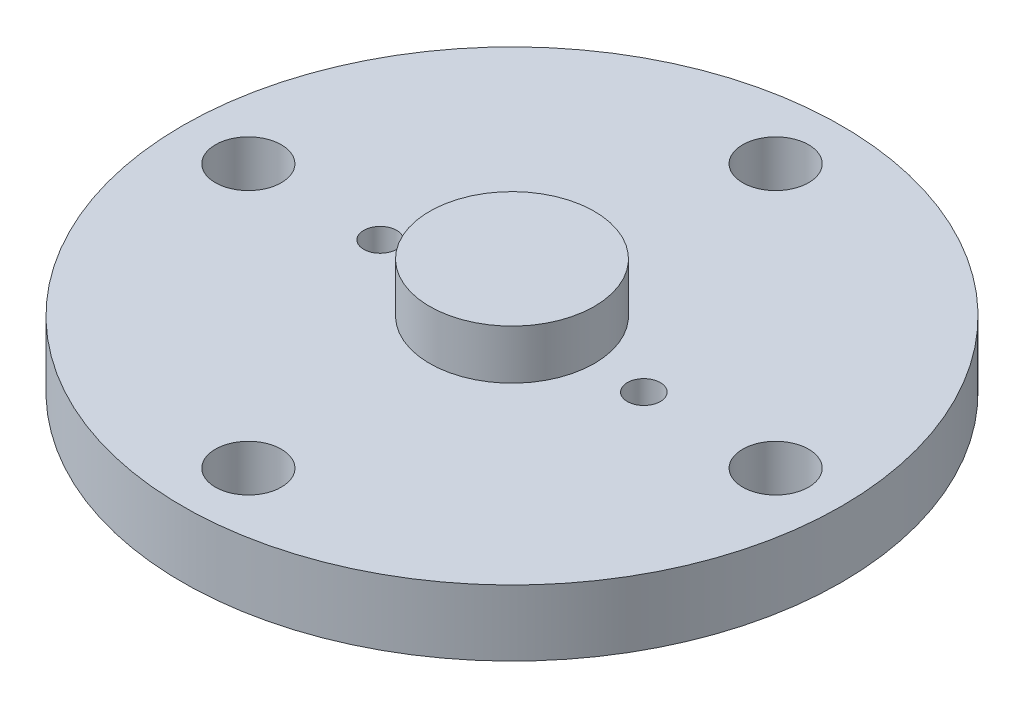
ISO-10303-21;
HEADER;
FILE_DESCRIPTION(('STEP AP214'),'2;1');
FILE_NAME('part.step','',(''),(''),'','','');
FILE_SCHEMA(('AUTOMOTIVE_DESIGN { 1 0 10303 214 1 1 1 1 }'));
ENDSEC;
DATA;
#1=APPLICATION_CONTEXT('core data for automotive mechanical design processes');
#2=APPLICATION_PROTOCOL_DEFINITION('international standard','automotive_design',2000,#1);
#3=PRODUCT_CONTEXT('',#1,'mechanical');
#4=PRODUCT('Part','Part','',(#3));
#5=PRODUCT_RELATED_PRODUCT_CATEGORY('part','',(#4));
#6=PRODUCT_DEFINITION_FORMATION('','',#4);
#7=PRODUCT_DEFINITION_CONTEXT('part definition',#1,'design');
#8=PRODUCT_DEFINITION('design','',#6,#7);
#9=PRODUCT_DEFINITION_SHAPE('','',#8);
#10=(LENGTH_UNIT() NAMED_UNIT(*) SI_UNIT(.MILLI.,.METRE.));
#11=(NAMED_UNIT(*) PLANE_ANGLE_UNIT() SI_UNIT($,.RADIAN.));
#12=(NAMED_UNIT(*) SI_UNIT($,.STERADIAN.) SOLID_ANGLE_UNIT());
#13=UNCERTAINTY_MEASURE_WITH_UNIT(LENGTH_MEASURE(1.E-05),#10,'distance_accuracy_value','');
#14=(GEOMETRIC_REPRESENTATION_CONTEXT(3) GLOBAL_UNCERTAINTY_ASSIGNED_CONTEXT((#13)) GLOBAL_UNIT_ASSIGNED_CONTEXT((#10,
#11,#12)) REPRESENTATION_CONTEXT('',''));
#15=CARTESIAN_POINT('',(0.,0.,0.));
#16=DIRECTION('',(0.,0.,1.));
#17=DIRECTION('',(1.,0.,0.));
#18=AXIS2_PLACEMENT_3D('',#15,#16,#17);
#19=CARTESIAN_POINT('',(0.,0.,0.));
#20=DIRECTION('',(0.,1.,0.));
#21=DIRECTION('',(-1.,0.,0.));
#22=AXIS2_PLACEMENT_3D('',#19,#20,#21);
#23=PLANE('',#22);
#24=CARTESIAN_POINT('',(0.,0.,8.));
#25=DIRECTION('',(0.,1.,0.));
#26=DIRECTION('',(1.,0.,0.));
#27=AXIS2_PLACEMENT_3D('',#24,#25,#26);
#28=CIRCLE('',#27,0.999999999999999);
#29=CARTESIAN_POINT('',(0.99999999999997,0.,8.));
#30=VERTEX_POINT('',#29);
#31=EDGE_CURVE('E77',#30,#30,#28,.T.);
#32=ORIENTED_EDGE('',*,*,#31,.T.);
#33=EDGE_LOOP('',(#32));
#34=FACE_BOUND('',#33,.T.);
#35=CARTESIAN_POINT('',(0.,0.,-8.));
#36=DIRECTION('',(0.,1.,0.));
#37=DIRECTION('',(-1.,0.,0.));
#38=AXIS2_PLACEMENT_3D('',#35,#36,#37);
#39=CIRCLE('',#38,0.999999999999999);
#40=CARTESIAN_POINT('',(-1.00000000000003,0.,-8.));
#41=VERTEX_POINT('',#40);
#42=EDGE_CURVE('E71',#41,#41,#39,.T.);
#43=ORIENTED_EDGE('',*,*,#42,.T.);
#44=EDGE_LOOP('',(#43));
#45=FACE_BOUND('',#44,.T.);
#46=CARTESIAN_POINT('',(8.,0.,0.));
#47=DIRECTION('',(0.,1.,0.));
#48=DIRECTION('',(1.,0.,0.));
#49=AXIS2_PLACEMENT_3D('',#46,#47,#48);
#50=CIRCLE('',#49,1.);
#51=CARTESIAN_POINT('',(9.,0.,0.));
#52=VERTEX_POINT('',#51);
#53=EDGE_CURVE('E65',#52,#52,#50,.T.);
#54=ORIENTED_EDGE('',*,*,#53,.T.);
#55=EDGE_LOOP('',(#54));
#56=FACE_BOUND('',#55,.T.);
#57=CARTESIAN_POINT('',(4.,0.,0.));
#58=DIRECTION('',(0.,1.,0.));
#59=DIRECTION('',(1.,0.,0.));
#60=AXIS2_PLACEMENT_3D('',#57,#58,#59);
#61=CIRCLE('',#60,0.500000000000001);
#62=CARTESIAN_POINT('',(4.5,0.,0.));
#63=VERTEX_POINT('',#62);
#64=EDGE_CURVE('E59',#63,#63,#61,.T.);
#65=ORIENTED_EDGE('',*,*,#64,.T.);
#66=EDGE_LOOP('',(#65));
#67=FACE_BOUND('',#66,.T.);
#68=CARTESIAN_POINT('',(-4.,0.,0.));
#69=DIRECTION('',(0.,1.,0.));
#70=DIRECTION('',(-1.,0.,0.));
#71=AXIS2_PLACEMENT_3D('',#68,#69,#70);
#72=CIRCLE('',#71,0.5);
#73=CARTESIAN_POINT('',(-4.5,0.,0.));
#74=VERTEX_POINT('',#73);
#75=EDGE_CURVE('E53',#74,#74,#72,.T.);
#76=ORIENTED_EDGE('',*,*,#75,.T.);
#77=EDGE_LOOP('',(#76));
#78=FACE_BOUND('',#77,.T.);
#79=CARTESIAN_POINT('',(-8.,0.,0.));
#80=DIRECTION('',(0.,1.,0.));
#81=DIRECTION('',(-1.,0.,0.));
#82=AXIS2_PLACEMENT_3D('',#79,#80,#81);
#83=CIRCLE('',#82,1.);
#84=CARTESIAN_POINT('',(-9.,0.,0.));
#85=VERTEX_POINT('',#84);
#86=EDGE_CURVE('E49',#85,#85,#83,.T.);
#87=ORIENTED_EDGE('',*,*,#86,.T.);
#88=EDGE_LOOP('',(#87));
#89=FACE_BOUND('',#88,.T.);
#90=CARTESIAN_POINT('',(0.,0.,0.));
#91=DIRECTION('',(0.,-1.,0.));
#92=DIRECTION('',(1.,0.,0.));
#93=AXIS2_PLACEMENT_3D('',#90,#91,#92);
#94=CIRCLE('',#93,10.);
#95=CARTESIAN_POINT('',(10.,0.,0.));
#96=VERTEX_POINT('',#95);
#97=EDGE_CURVE('E10',#96,#96,#94,.T.);
#98=ORIENTED_EDGE('',*,*,#97,.T.);
#99=EDGE_LOOP('',(#98));
#100=FACE_BOUND('',#99,.T.);
#101=ADVANCED_FACE('F30',(#34,#45,#56,#67,#78,#89,#100),#23,.F.);
#102=CARTESIAN_POINT('',(0.,0.,0.));
#103=DIRECTION('',(0.,-1.,0.));
#104=DIRECTION('',(1.,0.,0.));
#105=AXIS2_PLACEMENT_3D('',#102,#103,#104);
#106=CYLINDRICAL_SURFACE('',#105,10.);
#107=ORIENTED_EDGE('',*,*,#97,.F.);
#108=EDGE_LOOP('',(#107));
#109=FACE_BOUND('',#108,.T.);
#110=CARTESIAN_POINT('',(0.,2.,0.));
#111=DIRECTION('',(0.,-1.,0.));
#112=DIRECTION('',(1.,0.,0.));
#113=AXIS2_PLACEMENT_3D('',#110,#111,#112);
#114=CIRCLE('',#113,10.);
#115=CARTESIAN_POINT('',(10.,2.,0.));
#116=VERTEX_POINT('',#115);
#117=EDGE_CURVE('E36',#116,#116,#114,.T.);
#118=ORIENTED_EDGE('',*,*,#117,.T.);
#119=EDGE_LOOP('',(#118));
#120=FACE_BOUND('',#119,.T.);
#121=ADVANCED_FACE('F99',(#109,#120),#106,.T.);
#122=CARTESIAN_POINT('',(-10.,2.,0.));
#123=DIRECTION('',(0.,-1.,0.));
#124=DIRECTION('',(1.,0.,0.));
#125=AXIS2_PLACEMENT_3D('',#122,#123,#124);
#126=PLANE('',#125);
#127=CARTESIAN_POINT('',(0.,2.,8.));
#128=DIRECTION('',(0.,1.,0.));
#129=DIRECTION('',(1.,0.,0.));
#130=AXIS2_PLACEMENT_3D('',#127,#128,#129);
#131=CIRCLE('',#130,0.999999999999999);
#132=CARTESIAN_POINT('',(0.999999999999969,2.,8.));
#133=VERTEX_POINT('',#132);
#134=EDGE_CURVE('E80',#133,#133,#131,.T.);
#135=ORIENTED_EDGE('',*,*,#134,.F.);
#136=EDGE_LOOP('',(#135));
#137=FACE_BOUND('',#136,.T.);
#138=CARTESIAN_POINT('',(0.,2.,-8.));
#139=DIRECTION('',(0.,1.,0.));
#140=DIRECTION('',(-1.,0.,0.));
#141=AXIS2_PLACEMENT_3D('',#138,#139,#140);
#142=CIRCLE('',#141,0.999999999999999);
#143=CARTESIAN_POINT('',(-1.00000000000003,2.,-8.));
#144=VERTEX_POINT('',#143);
#145=EDGE_CURVE('E74',#144,#144,#142,.T.);
#146=ORIENTED_EDGE('',*,*,#145,.F.);
#147=EDGE_LOOP('',(#146));
#148=FACE_BOUND('',#147,.T.);
#149=CARTESIAN_POINT('',(8.,2.,0.));
#150=DIRECTION('',(0.,1.,0.));
#151=DIRECTION('',(1.,0.,0.));
#152=AXIS2_PLACEMENT_3D('',#149,#150,#151);
#153=CIRCLE('',#152,1.);
#154=CARTESIAN_POINT('',(9.,2.,0.));
#155=VERTEX_POINT('',#154);
#156=EDGE_CURVE('E68',#155,#155,#153,.T.);
#157=ORIENTED_EDGE('',*,*,#156,.F.);
#158=EDGE_LOOP('',(#157));
#159=FACE_BOUND('',#158,.T.);
#160=CARTESIAN_POINT('',(4.,2.,0.));
#161=DIRECTION('',(0.,1.,0.));
#162=DIRECTION('',(1.,0.,0.));
#163=AXIS2_PLACEMENT_3D('',#160,#161,#162);
#164=CIRCLE('',#163,0.500000000000001);
#165=CARTESIAN_POINT('',(4.5,2.,0.));
#166=VERTEX_POINT('',#165);
#167=EDGE_CURVE('E62',#166,#166,#164,.T.);
#168=ORIENTED_EDGE('',*,*,#167,.F.);
#169=EDGE_LOOP('',(#168));
#170=FACE_BOUND('',#169,.T.);
#171=CARTESIAN_POINT('',(-4.,2.,0.));
#172=DIRECTION('',(0.,1.,0.));
#173=DIRECTION('',(-1.,0.,0.));
#174=AXIS2_PLACEMENT_3D('',#171,#172,#173);
#175=CIRCLE('',#174,0.5);
#176=CARTESIAN_POINT('',(-4.5,2.,0.));
#177=VERTEX_POINT('',#176);
#178=EDGE_CURVE('E56',#177,#177,#175,.T.);
#179=ORIENTED_EDGE('',*,*,#178,.F.);
#180=EDGE_LOOP('',(#179));
#181=FACE_BOUND('',#180,.T.);
#182=CARTESIAN_POINT('',(-8.,2.,0.));
#183=DIRECTION('',(0.,1.,0.));
#184=DIRECTION('',(-1.,0.,0.));
#185=AXIS2_PLACEMENT_3D('',#182,#183,#184);
#186=CIRCLE('',#185,1.);
#187=CARTESIAN_POINT('',(-9.,2.,0.));
#188=VERTEX_POINT('',#187);
#189=EDGE_CURVE('E50',#188,#188,#186,.T.);
#190=ORIENTED_EDGE('',*,*,#189,.F.);
#191=EDGE_LOOP('',(#190));
#192=FACE_BOUND('',#191,.T.);
#193=ORIENTED_EDGE('',*,*,#117,.F.);
#194=EDGE_LOOP('',(#193));
#195=FACE_BOUND('',#194,.T.);
#196=CARTESIAN_POINT('',(0.,2.,0.));
#197=DIRECTION('',(0.,-1.,0.));
#198=DIRECTION('',(1.,0.,0.));
#199=AXIS2_PLACEMENT_3D('',#196,#197,#198);
#200=CIRCLE('',#199,2.5);
#201=CARTESIAN_POINT('',(2.5,2.,0.));
#202=VERTEX_POINT('',#201);
#203=EDGE_CURVE('E40',#202,#202,#200,.T.);
#204=ORIENTED_EDGE('',*,*,#203,.T.);
#205=EDGE_LOOP('',(#204));
#206=FACE_BOUND('',#205,.T.);
#207=ADVANCED_FACE('F95',(#137,#148,#159,#170,#181,#192,#195,#206),#126,.F.);
#208=CARTESIAN_POINT('',(0.,0.,0.));
#209=DIRECTION('',(0.,-1.,0.));
#210=DIRECTION('',(1.,0.,0.));
#211=AXIS2_PLACEMENT_3D('',#208,#209,#210);
#212=CYLINDRICAL_SURFACE('',#211,2.5);
#213=ORIENTED_EDGE('',*,*,#203,.F.);
#214=EDGE_LOOP('',(#213));
#215=FACE_BOUND('',#214,.T.);
#216=CARTESIAN_POINT('',(0.,3.5,0.));
#217=DIRECTION('',(0.,-1.,0.));
#218=DIRECTION('',(1.,0.,0.));
#219=AXIS2_PLACEMENT_3D('',#216,#217,#218);
#220=CIRCLE('',#219,2.5);
#221=CARTESIAN_POINT('',(2.5,3.5,0.));
#222=VERTEX_POINT('',#221);
#223=EDGE_CURVE('E44',#222,#222,#220,.T.);
#224=ORIENTED_EDGE('',*,*,#223,.T.);
#225=EDGE_LOOP('',(#224));
#226=FACE_BOUND('',#225,.T.);
#227=ADVANCED_FACE('F98',(#215,#226),#212,.T.);
#228=CARTESIAN_POINT('',(-2.5,3.5,0.));
#229=DIRECTION('',(0.,-1.,0.));
#230=DIRECTION('',(1.,0.,0.));
#231=AXIS2_PLACEMENT_3D('',#228,#229,#230);
#232=PLANE('',#231);
#233=ORIENTED_EDGE('',*,*,#223,.F.);
#234=EDGE_LOOP('',(#233));
#235=FACE_BOUND('',#234,.T.);
#236=ADVANCED_FACE('F116',(#235),#232,.F.);
#237=CARTESIAN_POINT('',(-8.,0.,0.));
#238=DIRECTION('',(0.,1.,0.));
#239=DIRECTION('',(-1.,0.,0.));
#240=AXIS2_PLACEMENT_3D('',#237,#238,#239);
#241=CYLINDRICAL_SURFACE('',#240,1.);
#242=ORIENTED_EDGE('',*,*,#86,.F.);
#243=EDGE_LOOP('',(#242));
#244=FACE_BOUND('',#243,.T.);
#245=ORIENTED_EDGE('',*,*,#189,.T.);
#246=EDGE_LOOP('',(#245));
#247=FACE_BOUND('',#246,.T.);
#248=ADVANCED_FACE('F121',(#244,#247),#241,.F.);
#249=CARTESIAN_POINT('',(-4.,0.,0.));
#250=DIRECTION('',(0.,1.,0.));
#251=DIRECTION('',(-1.,0.,0.));
#252=AXIS2_PLACEMENT_3D('',#249,#250,#251);
#253=CYLINDRICAL_SURFACE('',#252,0.5);
#254=ORIENTED_EDGE('',*,*,#75,.F.);
#255=EDGE_LOOP('',(#254));
#256=FACE_BOUND('',#255,.T.);
#257=ORIENTED_EDGE('',*,*,#178,.T.);
#258=EDGE_LOOP('',(#257));
#259=FACE_BOUND('',#258,.T.);
#260=ADVANCED_FACE('F126',(#256,#259),#253,.F.);
#261=CARTESIAN_POINT('',(4.,0.,0.));
#262=DIRECTION('',(0.,1.,0.));
#263=DIRECTION('',(-1.,0.,0.));
#264=AXIS2_PLACEMENT_3D('',#261,#262,#263);
#265=CYLINDRICAL_SURFACE('',#264,0.500000000000001);
#266=ORIENTED_EDGE('',*,*,#64,.F.);
#267=EDGE_LOOP('',(#266));
#268=FACE_BOUND('',#267,.T.);
#269=ORIENTED_EDGE('',*,*,#167,.T.);
#270=EDGE_LOOP('',(#269));
#271=FACE_BOUND('',#270,.T.);
#272=ADVANCED_FACE('F171',(#268,#271),#265,.F.);
#273=CARTESIAN_POINT('',(8.,0.,0.));
#274=DIRECTION('',(0.,1.,0.));
#275=DIRECTION('',(-1.,0.,0.));
#276=AXIS2_PLACEMENT_3D('',#273,#274,#275);
#277=CYLINDRICAL_SURFACE('',#276,1.);
#278=ORIENTED_EDGE('',*,*,#53,.F.);
#279=EDGE_LOOP('',(#278));
#280=FACE_BOUND('',#279,.T.);
#281=ORIENTED_EDGE('',*,*,#156,.T.);
#282=EDGE_LOOP('',(#281));
#283=FACE_BOUND('',#282,.T.);
#284=ADVANCED_FACE('F180',(#280,#283),#277,.F.);
#285=CARTESIAN_POINT('',(0.,0.,-8.));
#286=DIRECTION('',(0.,1.,0.));
#287=DIRECTION('',(-1.,0.,0.));
#288=AXIS2_PLACEMENT_3D('',#285,#286,#287);
#289=CYLINDRICAL_SURFACE('',#288,0.999999999999999);
#290=ORIENTED_EDGE('',*,*,#42,.F.);
#291=EDGE_LOOP('',(#290));
#292=FACE_BOUND('',#291,.T.);
#293=ORIENTED_EDGE('',*,*,#145,.T.);
#294=EDGE_LOOP('',(#293));
#295=FACE_BOUND('',#294,.T.);
#296=ADVANCED_FACE('F91',(#292,#295),#289,.F.);
#297=CARTESIAN_POINT('',(0.,0.,8.));
#298=DIRECTION('',(0.,1.,0.));
#299=DIRECTION('',(-1.,0.,0.));
#300=AXIS2_PLACEMENT_3D('',#297,#298,#299);
#301=CYLINDRICAL_SURFACE('',#300,0.999999999999999);
#302=ORIENTED_EDGE('',*,*,#31,.F.);
#303=EDGE_LOOP('',(#302));
#304=FACE_BOUND('',#303,.T.);
#305=ORIENTED_EDGE('',*,*,#134,.T.);
#306=EDGE_LOOP('',(#305));
#307=FACE_BOUND('',#306,.T.);
#308=ADVANCED_FACE('F88',(#304,#307),#301,.F.);
#309=CLOSED_SHELL('',(#101,#121,#207,#227,#236,#248,#260,#272,#284,#296,#308));
#310=MANIFOLD_SOLID_BREP('B2',#309);
#311=ADVANCED_BREP_SHAPE_REPRESENTATION('',(#18,#310),#14);
#312=SHAPE_DEFINITION_REPRESENTATION(#9,#311);
ENDSEC;
END-ISO-10303-21;
